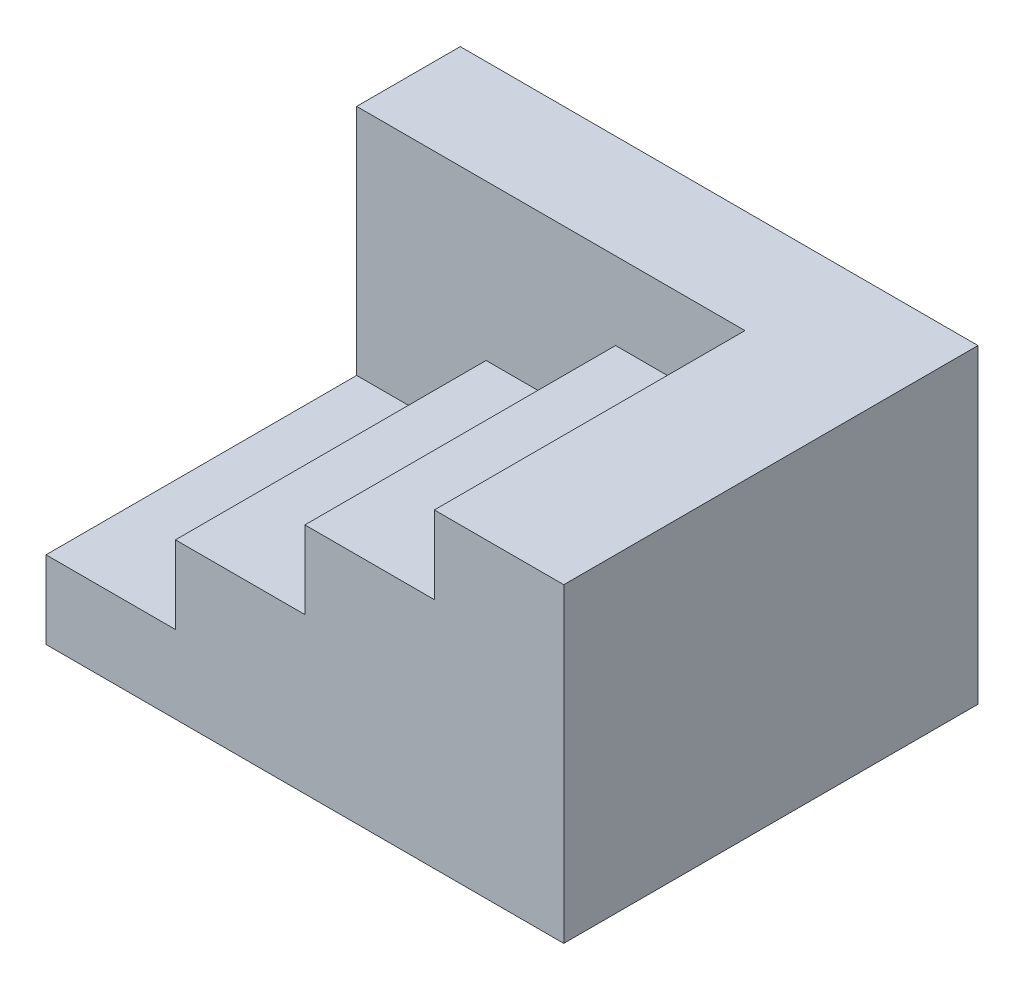
ISO-10303-21;
HEADER;
FILE_DESCRIPTION(('STEP AP214'),'2;1');
FILE_NAME('part.step','',(''),(''),'','','');
FILE_SCHEMA(('AUTOMOTIVE_DESIGN { 1 0 10303 214 1 1 1 1 }'));
ENDSEC;
DATA;
#1=APPLICATION_CONTEXT('core data for automotive mechanical design processes');
#2=APPLICATION_PROTOCOL_DEFINITION('international standard','automotive_design',2000,#1);
#3=PRODUCT_CONTEXT('',#1,'mechanical');
#4=PRODUCT('Part','Part','',(#3));
#5=PRODUCT_RELATED_PRODUCT_CATEGORY('part','',(#4));
#6=PRODUCT_DEFINITION_FORMATION('','',#4);
#7=PRODUCT_DEFINITION_CONTEXT('part definition',#1,'design');
#8=PRODUCT_DEFINITION('design','',#6,#7);
#9=PRODUCT_DEFINITION_SHAPE('','',#8);
#10=(LENGTH_UNIT() NAMED_UNIT(*) SI_UNIT(.MILLI.,.METRE.));
#11=(NAMED_UNIT(*) PLANE_ANGLE_UNIT() SI_UNIT($,.RADIAN.));
#12=(NAMED_UNIT(*) SI_UNIT($,.STERADIAN.) SOLID_ANGLE_UNIT());
#13=UNCERTAINTY_MEASURE_WITH_UNIT(LENGTH_MEASURE(1.E-05),#10,'distance_accuracy_value','');
#14=(GEOMETRIC_REPRESENTATION_CONTEXT(3) GLOBAL_UNCERTAINTY_ASSIGNED_CONTEXT((#13)) GLOBAL_UNIT_ASSIGNED_CONTEXT((#10,
#11,#12)) REPRESENTATION_CONTEXT('',''));
#15=CARTESIAN_POINT('',(0.,0.,0.));
#16=DIRECTION('',(0.,0.,1.));
#17=DIRECTION('',(1.,0.,0.));
#18=AXIS2_PLACEMENT_3D('',#15,#16,#17);
#19=CARTESIAN_POINT('',(-50.,60.,40.));
#20=DIRECTION('',(-1.,0.,0.));
#21=DIRECTION('',(0.,0.,1.));
#22=AXIS2_PLACEMENT_3D('',#19,#20,#21);
#23=PLANE('',#22);
#24=DIRECTION('',(0.,-1.,0.));
#25=VECTOR('',#24,1.);
#26=CARTESIAN_POINT('',(-50.,60.,40.));
#27=LINE('',#26,#25);
#28=CARTESIAN_POINT('',(-50.,15.,40.));
#29=VERTEX_POINT('',#28);
#30=CARTESIAN_POINT('',(-50.,0.,40.));
#31=VERTEX_POINT('',#30);
#32=EDGE_CURVE('E11',#29,#31,#27,.T.);
#33=ORIENTED_EDGE('',*,*,#32,.F.);
#34=DIRECTION('',(0.,0.,1.));
#35=VECTOR('',#34,1.);
#36=CARTESIAN_POINT('',(-50.,15.,-20.));
#37=LINE('',#36,#35);
#38=CARTESIAN_POINT('',(-50.,15.,-20.));
#39=VERTEX_POINT('',#38);
#40=EDGE_CURVE('E201',#39,#29,#37,.T.);
#41=ORIENTED_EDGE('',*,*,#40,.F.);
#42=DIRECTION('',(0.,-1.,0.));
#43=VECTOR('',#42,1.);
#44=CARTESIAN_POINT('',(-50.,0.,-20.));
#45=LINE('',#44,#43);
#46=CARTESIAN_POINT('',(-50.,60.,-20.));
#47=VERTEX_POINT('',#46);
#48=EDGE_CURVE('E158',#47,#39,#45,.T.);
#49=ORIENTED_EDGE('',*,*,#48,.F.);
#50=DIRECTION('',(0.,0.,-1.));
#51=VECTOR('',#50,1.);
#52=CARTESIAN_POINT('',(-50.,60.,40.));
#53=LINE('',#52,#51);
#54=CARTESIAN_POINT('',(-50.,60.,-40.));
#55=VERTEX_POINT('',#54);
#56=EDGE_CURVE('E95',#47,#55,#53,.T.);
#57=ORIENTED_EDGE('',*,*,#56,.T.);
#58=DIRECTION('',(0.,-1.,0.));
#59=VECTOR('',#58,1.);
#60=CARTESIAN_POINT('',(-50.,60.,-40.));
#61=LINE('',#60,#59);
#62=CARTESIAN_POINT('',(-50.,0.,-40.));
#63=VERTEX_POINT('',#62);
#64=EDGE_CURVE('E48',#55,#63,#61,.T.);
#65=ORIENTED_EDGE('',*,*,#64,.T.);
#66=DIRECTION('',(0.,0.,-1.));
#67=VECTOR('',#66,1.);
#68=CARTESIAN_POINT('',(-50.,0.,40.));
#69=LINE('',#68,#67);
#70=EDGE_CURVE('E204',#31,#63,#69,.T.);
#71=ORIENTED_EDGE('',*,*,#70,.F.);
#72=EDGE_LOOP('',(#33,#41,#49,#57,#65,#71));
#73=FACE_BOUND('',#72,.T.);
#74=ADVANCED_FACE('F45',(#73),#23,.T.);
#75=CARTESIAN_POINT('',(-50.,60.,40.));
#76=DIRECTION('',(0.,0.,-1.));
#77=DIRECTION('',(-1.,0.,0.));
#78=AXIS2_PLACEMENT_3D('',#75,#76,#77);
#79=PLANE('',#78);
#80=DIRECTION('',(-1.,0.,0.));
#81=VECTOR('',#80,1.);
#82=CARTESIAN_POINT('',(0.,15.,40.));
#83=LINE('',#82,#81);
#84=CARTESIAN_POINT('',(-25.,15.,40.));
#85=VERTEX_POINT('',#84);
#86=EDGE_CURVE('E155',#85,#29,#83,.T.);
#87=ORIENTED_EDGE('',*,*,#86,.T.);
#88=ORIENTED_EDGE('',*,*,#32,.T.);
#89=DIRECTION('',(1.,0.,0.));
#90=VECTOR('',#89,1.);
#91=CARTESIAN_POINT('',(-50.,0.,40.));
#92=LINE('',#91,#90);
#93=CARTESIAN_POINT('',(50.,0.,40.));
#94=VERTEX_POINT('',#93);
#95=EDGE_CURVE('E222',#31,#94,#92,.T.);
#96=ORIENTED_EDGE('',*,*,#95,.T.);
#97=DIRECTION('',(0.,-1.,0.));
#98=VECTOR('',#97,1.);
#99=CARTESIAN_POINT('',(50.,60.,40.));
#100=LINE('',#99,#98);
#101=CARTESIAN_POINT('',(50.,60.,40.));
#102=VERTEX_POINT('',#101);
#103=EDGE_CURVE('E54',#102,#94,#100,.T.);
#104=ORIENTED_EDGE('',*,*,#103,.F.);
#105=DIRECTION('',(1.,0.,0.));
#106=VECTOR('',#105,1.);
#107=CARTESIAN_POINT('',(-50.,60.,40.));
#108=LINE('',#107,#106);
#109=CARTESIAN_POINT('',(25.,60.,40.));
#110=VERTEX_POINT('',#109);
#111=EDGE_CURVE('E71',#110,#102,#108,.T.);
#112=ORIENTED_EDGE('',*,*,#111,.F.);
#113=DIRECTION('',(0.,-1.,0.));
#114=VECTOR('',#113,1.);
#115=CARTESIAN_POINT('',(25.,0.,40.));
#116=LINE('',#115,#114);
#117=CARTESIAN_POINT('',(25.,45.,40.));
#118=VERTEX_POINT('',#117);
#119=EDGE_CURVE('E163',#110,#118,#116,.T.);
#120=ORIENTED_EDGE('',*,*,#119,.T.);
#121=DIRECTION('',(-1.,0.,0.));
#122=VECTOR('',#121,1.);
#123=CARTESIAN_POINT('',(0.,45.,40.));
#124=LINE('',#123,#122);
#125=CARTESIAN_POINT('',(0.,45.,40.));
#126=VERTEX_POINT('',#125);
#127=EDGE_CURVE('E167',#118,#126,#124,.T.);
#128=ORIENTED_EDGE('',*,*,#127,.T.);
#129=DIRECTION('',(0.,-1.,0.));
#130=VECTOR('',#129,1.);
#131=CARTESIAN_POINT('',(0.,0.,40.));
#132=LINE('',#131,#130);
#133=CARTESIAN_POINT('',(0.,30.,40.));
#134=VERTEX_POINT('',#133);
#135=EDGE_CURVE('E194',#126,#134,#132,.T.);
#136=ORIENTED_EDGE('',*,*,#135,.T.);
#137=DIRECTION('',(-1.,0.,0.));
#138=VECTOR('',#137,1.);
#139=CARTESIAN_POINT('',(0.,30.,40.));
#140=LINE('',#139,#138);
#141=CARTESIAN_POINT('',(-25.,30.,40.));
#142=VERTEX_POINT('',#141);
#143=EDGE_CURVE('E190',#134,#142,#140,.T.);
#144=ORIENTED_EDGE('',*,*,#143,.T.);
#145=DIRECTION('',(0.,-1.,0.));
#146=VECTOR('',#145,1.);
#147=CARTESIAN_POINT('',(-25.,0.,40.));
#148=LINE('',#147,#146);
#149=EDGE_CURVE('E187',#142,#85,#148,.T.);
#150=ORIENTED_EDGE('',*,*,#149,.T.);
#151=EDGE_LOOP('',(#87,#88,#96,#104,#112,#120,#128,#136,#144,#150));
#152=FACE_BOUND('',#151,.T.);
#153=ADVANCED_FACE('F258',(#152),#79,.F.);
#154=CARTESIAN_POINT('',(0.,60.,0.));
#155=DIRECTION('',(0.,-1.,0.));
#156=DIRECTION('',(0.,0.,-1.));
#157=AXIS2_PLACEMENT_3D('',#154,#155,#156);
#158=PLANE('',#157);
#159=DIRECTION('',(0.,0.,1.));
#160=VECTOR('',#159,1.);
#161=CARTESIAN_POINT('',(25.,60.,-20.));
#162=LINE('',#161,#160);
#163=CARTESIAN_POINT('',(25.,60.,-20.));
#164=VERTEX_POINT('',#163);
#165=EDGE_CURVE('E205',#164,#110,#162,.T.);
#166=ORIENTED_EDGE('',*,*,#165,.T.);
#167=ORIENTED_EDGE('',*,*,#111,.T.);
#168=DIRECTION('',(0.,0.,-1.));
#169=VECTOR('',#168,1.);
#170=CARTESIAN_POINT('',(50.,60.,40.));
#171=LINE('',#170,#169);
#172=CARTESIAN_POINT('',(50.,60.,-40.));
#173=VERTEX_POINT('',#172);
#174=EDGE_CURVE('E226',#102,#173,#171,.T.);
#175=ORIENTED_EDGE('',*,*,#174,.T.);
#176=DIRECTION('',(1.,0.,0.));
#177=VECTOR('',#176,1.);
#178=CARTESIAN_POINT('',(-50.,60.,-40.));
#179=LINE('',#178,#177);
#180=EDGE_CURVE('E221',#55,#173,#179,.T.);
#181=ORIENTED_EDGE('',*,*,#180,.F.);
#182=ORIENTED_EDGE('',*,*,#56,.F.);
#183=DIRECTION('',(-1.,0.,0.));
#184=VECTOR('',#183,1.);
#185=CARTESIAN_POINT('',(0.,60.,-20.));
#186=LINE('',#185,#184);
#187=EDGE_CURVE('E180',#164,#47,#186,.T.);
#188=ORIENTED_EDGE('',*,*,#187,.F.);
#189=EDGE_LOOP('',(#166,#167,#175,#181,#182,#188));
#190=FACE_BOUND('',#189,.T.);
#191=ADVANCED_FACE('F262',(#190),#158,.F.);
#192=CARTESIAN_POINT('',(50.,60.,40.));
#193=DIRECTION('',(-1.,0.,0.));
#194=DIRECTION('',(0.,0.,1.));
#195=AXIS2_PLACEMENT_3D('',#192,#193,#194);
#196=PLANE('',#195);
#197=DIRECTION('',(0.,0.,-1.));
#198=VECTOR('',#197,1.);
#199=CARTESIAN_POINT('',(50.,0.,40.));
#200=LINE('',#199,#198);
#201=CARTESIAN_POINT('',(50.,0.,-40.));
#202=VERTEX_POINT('',#201);
#203=EDGE_CURVE('E238',#94,#202,#200,.T.);
#204=ORIENTED_EDGE('',*,*,#203,.T.);
#205=DIRECTION('',(0.,-1.,0.));
#206=VECTOR('',#205,1.);
#207=CARTESIAN_POINT('',(50.,60.,-40.));
#208=LINE('',#207,#206);
#209=EDGE_CURVE('E246',#173,#202,#208,.T.);
#210=ORIENTED_EDGE('',*,*,#209,.F.);
#211=ORIENTED_EDGE('',*,*,#174,.F.);
#212=ORIENTED_EDGE('',*,*,#103,.T.);
#213=EDGE_LOOP('',(#204,#210,#211,#212));
#214=FACE_BOUND('',#213,.T.);
#215=ADVANCED_FACE('F261',(#214),#196,.F.);
#216=CARTESIAN_POINT('',(-50.,60.,-40.));
#217=DIRECTION('',(0.,0.,-1.));
#218=DIRECTION('',(-1.,0.,0.));
#219=AXIS2_PLACEMENT_3D('',#216,#217,#218);
#220=PLANE('',#219);
#221=DIRECTION('',(1.,0.,0.));
#222=VECTOR('',#221,1.);
#223=CARTESIAN_POINT('',(-50.,0.,-40.));
#224=LINE('',#223,#222);
#225=EDGE_CURVE('E234',#63,#202,#224,.T.);
#226=ORIENTED_EDGE('',*,*,#225,.F.);
#227=ORIENTED_EDGE('',*,*,#64,.F.);
#228=ORIENTED_EDGE('',*,*,#180,.T.);
#229=ORIENTED_EDGE('',*,*,#209,.T.);
#230=EDGE_LOOP('',(#226,#227,#228,#229));
#231=FACE_BOUND('',#230,.T.);
#232=ADVANCED_FACE('F254',(#231),#220,.T.);
#233=CARTESIAN_POINT('',(0.,0.,0.));
#234=DIRECTION('',(0.,-1.,0.));
#235=DIRECTION('',(0.,0.,-1.));
#236=AXIS2_PLACEMENT_3D('',#233,#234,#235);
#237=PLANE('',#236);
#238=ORIENTED_EDGE('',*,*,#70,.T.);
#239=ORIENTED_EDGE('',*,*,#225,.T.);
#240=ORIENTED_EDGE('',*,*,#203,.F.);
#241=ORIENTED_EDGE('',*,*,#95,.F.);
#242=EDGE_LOOP('',(#238,#239,#240,#241));
#243=FACE_BOUND('',#242,.T.);
#244=ADVANCED_FACE('F257',(#243),#237,.T.);
#245=CARTESIAN_POINT('',(0.,15.,-20.));
#246=DIRECTION('',(0.,1.,0.));
#247=DIRECTION('',(-1.,0.,0.));
#248=AXIS2_PLACEMENT_3D('',#245,#246,#247);
#249=PLANE('',#248);
#250=ORIENTED_EDGE('',*,*,#86,.F.);
#251=DIRECTION('',(0.,0.,1.));
#252=VECTOR('',#251,1.);
#253=CARTESIAN_POINT('',(-25.,15.,-20.));
#254=LINE('',#253,#252);
#255=CARTESIAN_POINT('',(-25.,15.,-20.));
#256=VERTEX_POINT('',#255);
#257=EDGE_CURVE('E143',#256,#85,#254,.T.);
#258=ORIENTED_EDGE('',*,*,#257,.F.);
#259=DIRECTION('',(-1.,0.,0.));
#260=VECTOR('',#259,1.);
#261=CARTESIAN_POINT('',(0.,15.,-20.));
#262=LINE('',#261,#260);
#263=EDGE_CURVE('E150',#256,#39,#262,.T.);
#264=ORIENTED_EDGE('',*,*,#263,.T.);
#265=ORIENTED_EDGE('',*,*,#40,.T.);
#266=EDGE_LOOP('',(#250,#258,#264,#265));
#267=FACE_BOUND('',#266,.T.);
#268=ADVANCED_FACE('F153',(#267),#249,.T.);
#269=CARTESIAN_POINT('',(25.,0.,-20.));
#270=DIRECTION('',(-1.,0.,0.));
#271=DIRECTION('',(0.,-1.,0.));
#272=AXIS2_PLACEMENT_3D('',#269,#270,#271);
#273=PLANE('',#272);
#274=ORIENTED_EDGE('',*,*,#119,.F.);
#275=ORIENTED_EDGE('',*,*,#165,.F.);
#276=DIRECTION('',(0.,-1.,0.));
#277=VECTOR('',#276,1.);
#278=CARTESIAN_POINT('',(25.,0.,-20.));
#279=LINE('',#278,#277);
#280=CARTESIAN_POINT('',(25.,45.,-20.));
#281=VERTEX_POINT('',#280);
#282=EDGE_CURVE('E62',#164,#281,#279,.T.);
#283=ORIENTED_EDGE('',*,*,#282,.T.);
#284=DIRECTION('',(0.,0.,1.));
#285=VECTOR('',#284,1.);
#286=CARTESIAN_POINT('',(25.,45.,-20.));
#287=LINE('',#286,#285);
#288=EDGE_CURVE('E208',#281,#118,#287,.T.);
#289=ORIENTED_EDGE('',*,*,#288,.T.);
#290=EDGE_LOOP('',(#274,#275,#283,#289));
#291=FACE_BOUND('',#290,.T.);
#292=ADVANCED_FACE('F278',(#291),#273,.T.);
#293=CARTESIAN_POINT('',(0.,45.,-20.));
#294=DIRECTION('',(0.,1.,0.));
#295=DIRECTION('',(0.,0.,1.));
#296=AXIS2_PLACEMENT_3D('',#293,#294,#295);
#297=PLANE('',#296);
#298=ORIENTED_EDGE('',*,*,#127,.F.);
#299=ORIENTED_EDGE('',*,*,#288,.F.);
#300=DIRECTION('',(-1.,0.,0.));
#301=VECTOR('',#300,1.);
#302=CARTESIAN_POINT('',(0.,45.,-20.));
#303=LINE('',#302,#301);
#304=CARTESIAN_POINT('',(0.,45.,-20.));
#305=VERTEX_POINT('',#304);
#306=EDGE_CURVE('E175',#281,#305,#303,.T.);
#307=ORIENTED_EDGE('',*,*,#306,.T.);
#308=DIRECTION('',(0.,0.,1.));
#309=VECTOR('',#308,1.);
#310=CARTESIAN_POINT('',(0.,45.,-20.));
#311=LINE('',#310,#309);
#312=EDGE_CURVE('E211',#305,#126,#311,.T.);
#313=ORIENTED_EDGE('',*,*,#312,.T.);
#314=EDGE_LOOP('',(#298,#299,#307,#313));
#315=FACE_BOUND('',#314,.T.);
#316=ADVANCED_FACE('F275',(#315),#297,.T.);
#317=CARTESIAN_POINT('',(0.,0.,-20.));
#318=DIRECTION('',(-1.,0.,0.));
#319=DIRECTION('',(0.,-1.,0.));
#320=AXIS2_PLACEMENT_3D('',#317,#318,#319);
#321=PLANE('',#320);
#322=ORIENTED_EDGE('',*,*,#135,.F.);
#323=ORIENTED_EDGE('',*,*,#312,.F.);
#324=DIRECTION('',(0.,-1.,0.));
#325=VECTOR('',#324,1.);
#326=CARTESIAN_POINT('',(0.,0.,-20.));
#327=LINE('',#326,#325);
#328=CARTESIAN_POINT('',(0.,30.,-20.));
#329=VERTEX_POINT('',#328);
#330=EDGE_CURVE('E172',#305,#329,#327,.T.);
#331=ORIENTED_EDGE('',*,*,#330,.T.);
#332=DIRECTION('',(0.,0.,1.));
#333=VECTOR('',#332,1.);
#334=CARTESIAN_POINT('',(0.,30.,-20.));
#335=LINE('',#334,#333);
#336=EDGE_CURVE('E214',#329,#134,#335,.T.);
#337=ORIENTED_EDGE('',*,*,#336,.T.);
#338=EDGE_LOOP('',(#322,#323,#331,#337));
#339=FACE_BOUND('',#338,.T.);
#340=ADVANCED_FACE('F272',(#339),#321,.T.);
#341=CARTESIAN_POINT('',(0.,30.,-20.));
#342=DIRECTION('',(0.,1.,0.));
#343=DIRECTION('',(-1.,0.,0.));
#344=AXIS2_PLACEMENT_3D('',#341,#342,#343);
#345=PLANE('',#344);
#346=ORIENTED_EDGE('',*,*,#143,.F.);
#347=ORIENTED_EDGE('',*,*,#336,.F.);
#348=DIRECTION('',(-1.,0.,0.));
#349=VECTOR('',#348,1.);
#350=CARTESIAN_POINT('',(0.,30.,-20.));
#351=LINE('',#350,#349);
#352=CARTESIAN_POINT('',(-25.,30.,-20.));
#353=VERTEX_POINT('',#352);
#354=EDGE_CURVE('E149',#329,#353,#351,.T.);
#355=ORIENTED_EDGE('',*,*,#354,.T.);
#356=DIRECTION('',(0.,0.,1.));
#357=VECTOR('',#356,1.);
#358=CARTESIAN_POINT('',(-25.,30.,-20.));
#359=LINE('',#358,#357);
#360=EDGE_CURVE('E145',#353,#142,#359,.T.);
#361=ORIENTED_EDGE('',*,*,#360,.T.);
#362=EDGE_LOOP('',(#346,#347,#355,#361));
#363=FACE_BOUND('',#362,.T.);
#364=ADVANCED_FACE('F268',(#363),#345,.T.);
#365=CARTESIAN_POINT('',(-25.,0.,-20.));
#366=DIRECTION('',(-1.,0.,0.));
#367=DIRECTION('',(0.,-1.,0.));
#368=AXIS2_PLACEMENT_3D('',#365,#366,#367);
#369=PLANE('',#368);
#370=ORIENTED_EDGE('',*,*,#149,.F.);
#371=ORIENTED_EDGE('',*,*,#360,.F.);
#372=DIRECTION('',(0.,-1.,0.));
#373=VECTOR('',#372,1.);
#374=CARTESIAN_POINT('',(-25.,0.,-20.));
#375=LINE('',#374,#373);
#376=EDGE_CURVE('E139',#353,#256,#375,.T.);
#377=ORIENTED_EDGE('',*,*,#376,.T.);
#378=ORIENTED_EDGE('',*,*,#257,.T.);
#379=EDGE_LOOP('',(#370,#371,#377,#378));
#380=FACE_BOUND('',#379,.T.);
#381=ADVANCED_FACE('F142',(#380),#369,.T.);
#382=CARTESIAN_POINT('',(0.,0.,-20.));
#383=DIRECTION('',(0.,0.,1.));
#384=DIRECTION('',(1.,0.,0.));
#385=AXIS2_PLACEMENT_3D('',#382,#383,#384);
#386=PLANE('',#385);
#387=ORIENTED_EDGE('',*,*,#263,.F.);
#388=ORIENTED_EDGE('',*,*,#376,.F.);
#389=ORIENTED_EDGE('',*,*,#354,.F.);
#390=ORIENTED_EDGE('',*,*,#330,.F.);
#391=ORIENTED_EDGE('',*,*,#306,.F.);
#392=ORIENTED_EDGE('',*,*,#282,.F.);
#393=ORIENTED_EDGE('',*,*,#187,.T.);
#394=ORIENTED_EDGE('',*,*,#48,.T.);
#395=EDGE_LOOP('',(#387,#388,#389,#390,#391,#392,#393,#394));
#396=FACE_BOUND('',#395,.T.);
#397=ADVANCED_FACE('F160',(#396),#386,.T.);
#398=CLOSED_SHELL('',(#74,#153,#191,#215,#232,#244,#268,#292,#316,#340,#364,#381,#397));
#399=MANIFOLD_SOLID_BREP('B2',#398);
#400=ADVANCED_BREP_SHAPE_REPRESENTATION('',(#18,#399),#14);
#401=SHAPE_DEFINITION_REPRESENTATION(#9,#400);
ENDSEC;
END-ISO-10303-21;
